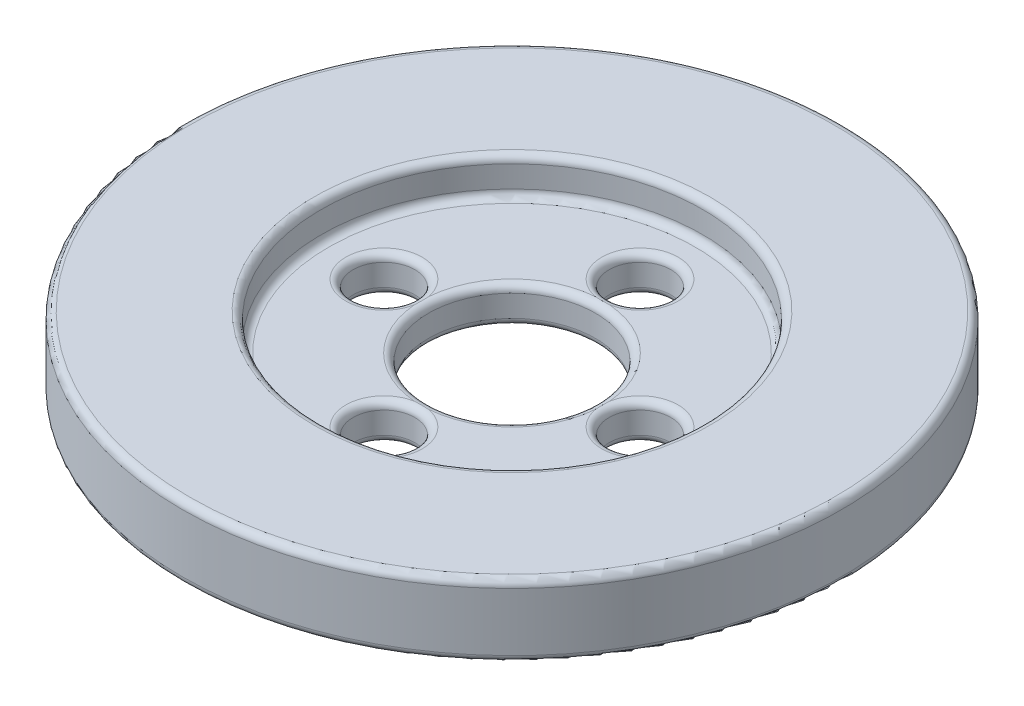
ISO-10303-21;
HEADER;
FILE_DESCRIPTION(('STEP AP214'),'2;1');
FILE_NAME('part.step','',(''),(''),'','','');
FILE_SCHEMA(('AUTOMOTIVE_DESIGN { 1 0 10303 214 1 1 1 1 }'));
ENDSEC;
DATA;
#1=APPLICATION_CONTEXT('core data for automotive mechanical design processes');
#2=APPLICATION_PROTOCOL_DEFINITION('international standard','automotive_design',2000,#1);
#3=PRODUCT_CONTEXT('',#1,'mechanical');
#4=PRODUCT('Part','Part','',(#3));
#5=PRODUCT_RELATED_PRODUCT_CATEGORY('part','',(#4));
#6=PRODUCT_DEFINITION_FORMATION('','',#4);
#7=PRODUCT_DEFINITION_CONTEXT('part definition',#1,'design');
#8=PRODUCT_DEFINITION('design','',#6,#7);
#9=PRODUCT_DEFINITION_SHAPE('','',#8);
#10=(LENGTH_UNIT() NAMED_UNIT(*) SI_UNIT(.MILLI.,.METRE.));
#11=(NAMED_UNIT(*) PLANE_ANGLE_UNIT() SI_UNIT($,.RADIAN.));
#12=(NAMED_UNIT(*) SI_UNIT($,.STERADIAN.) SOLID_ANGLE_UNIT());
#13=UNCERTAINTY_MEASURE_WITH_UNIT(LENGTH_MEASURE(1.E-05),#10,'distance_accuracy_value','');
#14=(GEOMETRIC_REPRESENTATION_CONTEXT(3) GLOBAL_UNCERTAINTY_ASSIGNED_CONTEXT((#13)) GLOBAL_UNIT_ASSIGNED_CONTEXT((#10,
#11,#12)) REPRESENTATION_CONTEXT('',''));
#15=CARTESIAN_POINT('',(0.,0.,0.));
#16=DIRECTION('',(0.,0.,1.));
#17=DIRECTION('',(1.,0.,0.));
#18=AXIS2_PLACEMENT_3D('',#15,#16,#17);
#19=CARTESIAN_POINT('',(0.,2.,0.));
#20=DIRECTION('',(0.,1.,0.));
#21=DIRECTION('',(0.,0.,1.));
#22=AXIS2_PLACEMENT_3D('',#19,#20,#21);
#23=PLANE('',#22);
#24=CARTESIAN_POINT('',(0.,2.,0.));
#25=DIRECTION('',(0.,1.,0.));
#26=DIRECTION('',(0.,0.,1.));
#27=AXIS2_PLACEMENT_3D('',#24,#25,#26);
#28=CIRCLE('',#27,10.9);
#29=CARTESIAN_POINT('',(0.,2.,10.9));
#30=VERTEX_POINT('',#29);
#31=EDGE_CURVE('E11',#30,#30,#28,.F.);
#32=ORIENTED_EDGE('',*,*,#31,.T.);
#33=EDGE_LOOP('',(#32));
#34=FACE_BOUND('',#33,.T.);
#35=CARTESIAN_POINT('',(0.,2.,0.));
#36=DIRECTION('',(0.,1.,0.));
#37=DIRECTION('',(0.,0.,1.));
#38=AXIS2_PLACEMENT_3D('',#35,#36,#37);
#39=CIRCLE('',#38,17.75);
#40=CARTESIAN_POINT('',(0.,2.,17.75));
#41=VERTEX_POINT('',#40);
#42=EDGE_CURVE('E52',#41,#41,#39,.T.);
#43=ORIENTED_EDGE('',*,*,#42,.T.);
#44=EDGE_LOOP('',(#43));
#45=FACE_BOUND('',#44,.T.);
#46=ADVANCED_FACE('F37',(#34,#45),#23,.T.);
#47=CARTESIAN_POINT('',(0.,2.,0.));
#48=DIRECTION('',(0.,-1.,0.));
#49=DIRECTION('',(0.,0.,-1.));
#50=AXIS2_PLACEMENT_3D('',#47,#48,#49);
#51=CYLINDRICAL_SURFACE('',#50,18.15);
#52=CARTESIAN_POINT('',(0.,-1.6,0.));
#53=DIRECTION('',(0.,1.,0.));
#54=DIRECTION('',(0.,0.,1.));
#55=AXIS2_PLACEMENT_3D('',#52,#53,#54);
#56=CIRCLE('',#55,18.15);
#57=CARTESIAN_POINT('',(0.,-1.6,18.15));
#58=VERTEX_POINT('',#57);
#59=EDGE_CURVE('E336',#58,#58,#56,.T.);
#60=ORIENTED_EDGE('',*,*,#59,.T.);
#61=EDGE_LOOP('',(#60));
#62=FACE_BOUND('',#61,.T.);
#63=CARTESIAN_POINT('',(0.,1.6,0.));
#64=DIRECTION('',(0.,1.,0.));
#65=DIRECTION('',(0.,0.,1.));
#66=AXIS2_PLACEMENT_3D('',#63,#64,#65);
#67=CIRCLE('',#66,18.15);
#68=CARTESIAN_POINT('',(0.,1.6,18.15));
#69=VERTEX_POINT('',#68);
#70=EDGE_CURVE('E333',#69,#69,#67,.F.);
#71=ORIENTED_EDGE('',*,*,#70,.T.);
#72=EDGE_LOOP('',(#71));
#73=FACE_BOUND('',#72,.T.);
#74=ADVANCED_FACE('F264',(#62,#73),#51,.T.);
#75=CARTESIAN_POINT('',(0.,2.,0.));
#76=DIRECTION('',(0.,-1.,0.));
#77=DIRECTION('',(0.,0.,-1.));
#78=AXIS2_PLACEMENT_3D('',#75,#76,#77);
#79=CYLINDRICAL_SURFACE('',#78,10.5);
#80=CARTESIAN_POINT('',(0.,0.4,0.));
#81=DIRECTION('',(0.,1.,0.));
#82=DIRECTION('',(0.,0.,1.));
#83=AXIS2_PLACEMENT_3D('',#80,#81,#82);
#84=CIRCLE('',#83,10.5);
#85=CARTESIAN_POINT('',(0.,0.4,10.5));
#86=VERTEX_POINT('',#85);
#87=EDGE_CURVE('E288',#86,#86,#84,.F.);
#88=ORIENTED_EDGE('',*,*,#87,.T.);
#89=EDGE_LOOP('',(#88));
#90=FACE_BOUND('',#89,.T.);
#91=CARTESIAN_POINT('',(0.,1.6,0.));
#92=DIRECTION('',(0.,1.,0.));
#93=DIRECTION('',(0.,0.,1.));
#94=AXIS2_PLACEMENT_3D('',#91,#92,#93);
#95=CIRCLE('',#94,10.5);
#96=CARTESIAN_POINT('',(0.,1.6,10.5));
#97=VERTEX_POINT('',#96);
#98=EDGE_CURVE('E293',#97,#97,#95,.T.);
#99=ORIENTED_EDGE('',*,*,#98,.T.);
#100=EDGE_LOOP('',(#99));
#101=FACE_BOUND('',#100,.T.);
#102=ADVANCED_FACE('F270',(#90,#101),#79,.F.);
#103=CARTESIAN_POINT('',(0.,0.,0.));
#104=DIRECTION('',(0.,1.,0.));
#105=DIRECTION('',(0.,0.,1.));
#106=AXIS2_PLACEMENT_3D('',#103,#104,#105);
#107=PLANE('',#106);
#108=CARTESIAN_POINT('',(0.,0.,0.));
#109=DIRECTION('',(0.,1.,0.));
#110=DIRECTION('',(0.,0.,1.));
#111=AXIS2_PLACEMENT_3D('',#108,#109,#110);
#112=CIRCLE('',#111,10.1);
#113=CARTESIAN_POINT('',(0.,0.,10.1));
#114=VERTEX_POINT('',#113);
#115=EDGE_CURVE('E291',#114,#114,#112,.T.);
#116=ORIENTED_EDGE('',*,*,#115,.T.);
#117=EDGE_LOOP('',(#116));
#118=FACE_BOUND('',#117,.T.);
#119=CARTESIAN_POINT('',(7.05,0.,0.));
#120=DIRECTION('',(0.,1.,0.));
#121=DIRECTION('',(0.,0.,1.));
#122=AXIS2_PLACEMENT_3D('',#119,#120,#121);
#123=CIRCLE('',#122,2.1);
#124=CARTESIAN_POINT('',(4.98528368794326,0.,-0.383336080648335));
#125=VERTEX_POINT('',#124);
#126=CARTESIAN_POINT('',(7.05,0.,2.1));
#127=VERTEX_POINT('',#126);
#128=EDGE_CURVE('E564',#125,#127,#123,.F.);
#129=ORIENTED_EDGE('',*,*,#128,.T.);
#130=CARTESIAN_POINT('',(7.05,0.,0.));
#131=DIRECTION('',(0.,1.,0.));
#132=DIRECTION('',(0.,0.,1.));
#133=AXIS2_PLACEMENT_3D('',#130,#131,#132);
#134=CIRCLE('',#133,2.1);
#135=CARTESIAN_POINT('',(4.98528368794326,0.,0.383336080648334));
#136=VERTEX_POINT('',#135);
#137=EDGE_CURVE('E294',#127,#136,#134,.F.);
#138=ORIENTED_EDGE('',*,*,#137,.T.);
#139=CARTESIAN_POINT('',(0.,0.,0.));
#140=DIRECTION('',(0.,1.,0.));
#141=DIRECTION('',(0.,0.,1.));
#142=AXIS2_PLACEMENT_3D('',#139,#140,#141);
#143=CIRCLE('',#142,5.);
#144=CARTESIAN_POINT('',(0.383336080648335,0.,4.98528368794326));
#145=VERTEX_POINT('',#144);
#146=EDGE_CURVE('E298',#136,#145,#143,.F.);
#147=ORIENTED_EDGE('',*,*,#146,.T.);
#148=CARTESIAN_POINT('',(0.,0.,7.05));
#149=DIRECTION('',(0.,1.,0.));
#150=DIRECTION('',(0.,0.,1.));
#151=AXIS2_PLACEMENT_3D('',#148,#149,#150);
#152=CIRCLE('',#151,2.1);
#153=CARTESIAN_POINT('',(0.,0.,9.15));
#154=VERTEX_POINT('',#153);
#155=EDGE_CURVE('E570',#145,#154,#152,.F.);
#156=ORIENTED_EDGE('',*,*,#155,.T.);
#157=CARTESIAN_POINT('',(0.,0.,7.05));
#158=DIRECTION('',(0.,1.,0.));
#159=DIRECTION('',(0.,0.,1.));
#160=AXIS2_PLACEMENT_3D('',#157,#158,#159);
#161=CIRCLE('',#160,2.1);
#162=CARTESIAN_POINT('',(-0.383336080648334,0.,4.98528368794326));
#163=VERTEX_POINT('',#162);
#164=EDGE_CURVE('E568',#154,#163,#161,.F.);
#165=ORIENTED_EDGE('',*,*,#164,.T.);
#166=CARTESIAN_POINT('',(0.,0.,0.));
#167=DIRECTION('',(0.,1.,0.));
#168=DIRECTION('',(0.,0.,1.));
#169=AXIS2_PLACEMENT_3D('',#166,#167,#168);
#170=CIRCLE('',#169,5.);
#171=CARTESIAN_POINT('',(-4.98528368794326,0.,0.383336080648333));
#172=VERTEX_POINT('',#171);
#173=EDGE_CURVE('E572',#163,#172,#170,.F.);
#174=ORIENTED_EDGE('',*,*,#173,.T.);
#175=CARTESIAN_POINT('',(-7.05,0.,0.));
#176=DIRECTION('',(0.,1.,0.));
#177=DIRECTION('',(0.,0.,1.));
#178=AXIS2_PLACEMENT_3D('',#175,#176,#177);
#179=CIRCLE('',#178,2.1);
#180=CARTESIAN_POINT('',(-7.05,0.,2.1));
#181=VERTEX_POINT('',#180);
#182=EDGE_CURVE('E132',#172,#181,#179,.F.);
#183=ORIENTED_EDGE('',*,*,#182,.T.);
#184=CARTESIAN_POINT('',(-7.05,0.,0.));
#185=DIRECTION('',(0.,1.,0.));
#186=DIRECTION('',(0.,0.,1.));
#187=AXIS2_PLACEMENT_3D('',#184,#185,#186);
#188=CIRCLE('',#187,2.1);
#189=CARTESIAN_POINT('',(-4.98528368794326,0.,-0.383336080648331));
#190=VERTEX_POINT('',#189);
#191=EDGE_CURVE('E126',#181,#190,#188,.F.);
#192=ORIENTED_EDGE('',*,*,#191,.T.);
#193=CARTESIAN_POINT('',(0.,0.,0.));
#194=DIRECTION('',(0.,1.,0.));
#195=DIRECTION('',(0.,0.,1.));
#196=AXIS2_PLACEMENT_3D('',#193,#194,#195);
#197=CIRCLE('',#196,5.);
#198=CARTESIAN_POINT('',(-0.383336080648334,0.,-4.98528368794326));
#199=VERTEX_POINT('',#198);
#200=EDGE_CURVE('E129',#190,#199,#197,.F.);
#201=ORIENTED_EDGE('',*,*,#200,.T.);
#202=CARTESIAN_POINT('',(0.,0.,-7.05));
#203=DIRECTION('',(0.,1.,0.));
#204=DIRECTION('',(0.,0.,1.));
#205=AXIS2_PLACEMENT_3D('',#202,#203,#204);
#206=CIRCLE('',#205,2.1);
#207=CARTESIAN_POINT('',(0.383336080648334,0.,-4.98528368794326));
#208=VERTEX_POINT('',#207);
#209=EDGE_CURVE('E135',#199,#208,#206,.F.);
#210=ORIENTED_EDGE('',*,*,#209,.T.);
#211=CARTESIAN_POINT('',(0.,0.,0.));
#212=DIRECTION('',(0.,1.,0.));
#213=DIRECTION('',(0.,0.,1.));
#214=AXIS2_PLACEMENT_3D('',#211,#212,#213);
#215=CIRCLE('',#214,5.);
#216=EDGE_CURVE('E567',#208,#125,#215,.F.);
#217=ORIENTED_EDGE('',*,*,#216,.T.);
#218=EDGE_LOOP('',(#129,#138,#147,#156,#165,#174,#183,#192,#201,#210,#217));
#219=FACE_BOUND('',#218,.T.);
#220=ADVANCED_FACE('F128',(#118,#219),#107,.T.);
#221=CARTESIAN_POINT('',(0.,-2.,0.));
#222=DIRECTION('',(0.,1.,0.));
#223=DIRECTION('',(0.,0.,1.));
#224=AXIS2_PLACEMENT_3D('',#221,#222,#223);
#225=PLANE('',#224);
#226=CARTESIAN_POINT('',(0.,-2.,0.));
#227=DIRECTION('',(0.,1.,0.));
#228=DIRECTION('',(0.,0.,1.));
#229=AXIS2_PLACEMENT_3D('',#226,#227,#228);
#230=CIRCLE('',#229,17.75);
#231=CARTESIAN_POINT('',(0.,-2.,17.75));
#232=VERTEX_POINT('',#231);
#233=EDGE_CURVE('E360',#232,#232,#230,.F.);
#234=ORIENTED_EDGE('',*,*,#233,.T.);
#235=EDGE_LOOP('',(#234));
#236=FACE_BOUND('',#235,.T.);
#237=CARTESIAN_POINT('',(-7.05,-2.,0.));
#238=DIRECTION('',(0.,1.,0.));
#239=DIRECTION('',(0.,0.,1.));
#240=AXIS2_PLACEMENT_3D('',#237,#238,#239);
#241=CIRCLE('',#240,2.1);
#242=CARTESIAN_POINT('',(-7.05,-2.,2.1));
#243=VERTEX_POINT('',#242);
#244=CARTESIAN_POINT('',(-4.98528368794326,-2.,0.383336080648325));
#245=VERTEX_POINT('',#244);
#246=EDGE_CURVE('E60',#243,#245,#241,.T.);
#247=ORIENTED_EDGE('',*,*,#246,.T.);
#248=CARTESIAN_POINT('',(0.,-2.,0.));
#249=DIRECTION('',(0.,1.,0.));
#250=DIRECTION('',(0.,0.,1.));
#251=AXIS2_PLACEMENT_3D('',#248,#249,#250);
#252=CIRCLE('',#251,5.);
#253=CARTESIAN_POINT('',(-0.383336080648324,-2.,4.98528368794326));
#254=VERTEX_POINT('',#253);
#255=EDGE_CURVE('E65',#245,#254,#252,.T.);
#256=ORIENTED_EDGE('',*,*,#255,.T.);
#257=CARTESIAN_POINT('',(0.,-2.,7.05));
#258=DIRECTION('',(0.,1.,0.));
#259=DIRECTION('',(0.,0.,1.));
#260=AXIS2_PLACEMENT_3D('',#257,#258,#259);
#261=CIRCLE('',#260,2.1);
#262=CARTESIAN_POINT('',(0.,-2.,9.15));
#263=VERTEX_POINT('',#262);
#264=EDGE_CURVE('E356',#254,#263,#261,.T.);
#265=ORIENTED_EDGE('',*,*,#264,.T.);
#266=CARTESIAN_POINT('',(0.,-2.,7.05));
#267=DIRECTION('',(0.,1.,0.));
#268=DIRECTION('',(0.,0.,1.));
#269=AXIS2_PLACEMENT_3D('',#266,#267,#268);
#270=CIRCLE('',#269,2.1);
#271=CARTESIAN_POINT('',(0.383336080648325,-2.,4.98528368794326));
#272=VERTEX_POINT('',#271);
#273=EDGE_CURVE('E354',#263,#272,#270,.T.);
#274=ORIENTED_EDGE('',*,*,#273,.T.);
#275=CARTESIAN_POINT('',(0.,-2.,0.));
#276=DIRECTION('',(0.,1.,0.));
#277=DIRECTION('',(0.,0.,1.));
#278=AXIS2_PLACEMENT_3D('',#275,#276,#277);
#279=CIRCLE('',#278,5.);
#280=CARTESIAN_POINT('',(4.98528368794326,-2.,0.383336080648333));
#281=VERTEX_POINT('',#280);
#282=EDGE_CURVE('E352',#272,#281,#279,.T.);
#283=ORIENTED_EDGE('',*,*,#282,.T.);
#284=CARTESIAN_POINT('',(7.05,-2.,0.));
#285=DIRECTION('',(0.,1.,0.));
#286=DIRECTION('',(0.,0.,1.));
#287=AXIS2_PLACEMENT_3D('',#284,#285,#286);
#288=CIRCLE('',#287,2.1);
#289=CARTESIAN_POINT('',(7.05,-2.,2.1));
#290=VERTEX_POINT('',#289);
#291=EDGE_CURVE('E348',#281,#290,#288,.T.);
#292=ORIENTED_EDGE('',*,*,#291,.T.);
#293=CARTESIAN_POINT('',(7.05,-2.,0.));
#294=DIRECTION('',(0.,1.,0.));
#295=DIRECTION('',(0.,0.,1.));
#296=AXIS2_PLACEMENT_3D('',#293,#294,#295);
#297=CIRCLE('',#296,2.1);
#298=CARTESIAN_POINT('',(4.98528368794326,-2.,-0.383336080648333));
#299=VERTEX_POINT('',#298);
#300=EDGE_CURVE('E346',#290,#299,#297,.T.);
#301=ORIENTED_EDGE('',*,*,#300,.T.);
#302=CARTESIAN_POINT('',(0.,-2.,0.));
#303=DIRECTION('',(0.,1.,0.));
#304=DIRECTION('',(0.,0.,1.));
#305=AXIS2_PLACEMENT_3D('',#302,#303,#304);
#306=CIRCLE('',#305,5.);
#307=CARTESIAN_POINT('',(0.383336080648324,-2.,-4.98528368794326));
#308=VERTEX_POINT('',#307);
#309=EDGE_CURVE('E341',#299,#308,#306,.T.);
#310=ORIENTED_EDGE('',*,*,#309,.T.);
#311=CARTESIAN_POINT('',(0.,-2.,-7.05));
#312=DIRECTION('',(0.,1.,0.));
#313=DIRECTION('',(0.,0.,1.));
#314=AXIS2_PLACEMENT_3D('',#311,#312,#313);
#315=CIRCLE('',#314,2.1);
#316=CARTESIAN_POINT('',(-0.383336080648324,-2.,-4.98528368794326));
#317=VERTEX_POINT('',#316);
#318=EDGE_CURVE('E339',#308,#317,#315,.T.);
#319=ORIENTED_EDGE('',*,*,#318,.T.);
#320=CARTESIAN_POINT('',(0.,-2.,0.));
#321=DIRECTION('',(0.,1.,0.));
#322=DIRECTION('',(0.,0.,1.));
#323=AXIS2_PLACEMENT_3D('',#320,#321,#322);
#324=CIRCLE('',#323,5.);
#325=CARTESIAN_POINT('',(-4.98528368794326,-2.,-0.383336080648323));
#326=VERTEX_POINT('',#325);
#327=EDGE_CURVE('E343',#317,#326,#324,.T.);
#328=ORIENTED_EDGE('',*,*,#327,.T.);
#329=CARTESIAN_POINT('',(-7.05,-2.,0.));
#330=DIRECTION('',(0.,1.,0.));
#331=DIRECTION('',(0.,0.,1.));
#332=AXIS2_PLACEMENT_3D('',#329,#330,#331);
#333=CIRCLE('',#332,2.1);
#334=EDGE_CURVE('E350',#326,#243,#333,.T.);
#335=ORIENTED_EDGE('',*,*,#334,.T.);
#336=EDGE_LOOP('',(#247,#256,#265,#274,#283,#292,#301,#310,#319,#328,#335));
#337=FACE_BOUND('',#336,.T.);
#338=ADVANCED_FACE('F367',(#236,#337),#225,.F.);
#339=CARTESIAN_POINT('',(0.,-2.,0.));
#340=DIRECTION('',(0.,1.,0.));
#341=DIRECTION('',(0.,0.,1.));
#342=AXIS2_PLACEMENT_3D('',#339,#340,#341);
#343=CYLINDRICAL_SURFACE('',#342,4.6);
#344=CARTESIAN_POINT('',(0.,-0.4,0.));
#345=DIRECTION('',(0.,1.,0.));
#346=DIRECTION('',(0.,0.,1.));
#347=AXIS2_PLACEMENT_3D('',#344,#345,#346);
#348=CIRCLE('',#347,4.6);
#349=CARTESIAN_POINT('',(0.,-0.4,4.6));
#350=VERTEX_POINT('',#349);
#351=EDGE_CURVE('E330',#350,#350,#348,.T.);
#352=ORIENTED_EDGE('',*,*,#351,.T.);
#353=EDGE_LOOP('',(#352));
#354=FACE_BOUND('',#353,.T.);
#355=CARTESIAN_POINT('',(0.,-1.6,0.));
#356=DIRECTION('',(0.,1.,0.));
#357=DIRECTION('',(0.,0.,1.));
#358=AXIS2_PLACEMENT_3D('',#355,#356,#357);
#359=CIRCLE('',#358,4.6);
#360=CARTESIAN_POINT('',(0.,-1.6,4.6));
#361=VERTEX_POINT('',#360);
#362=EDGE_CURVE('E327',#361,#361,#359,.F.);
#363=ORIENTED_EDGE('',*,*,#362,.T.);
#364=EDGE_LOOP('',(#363));
#365=FACE_BOUND('',#364,.T.);
#366=ADVANCED_FACE('F373',(#354,#365),#343,.F.);
#367=CARTESIAN_POINT('',(-7.05,-2.,0.));
#368=DIRECTION('',(0.,1.,0.));
#369=DIRECTION('',(0.,0.,1.));
#370=AXIS2_PLACEMENT_3D('',#367,#368,#369);
#371=CYLINDRICAL_SURFACE('',#370,1.7);
#372=CARTESIAN_POINT('',(-7.05,-0.4,0.));
#373=DIRECTION('',(0.,1.,0.));
#374=DIRECTION('',(0.,0.,1.));
#375=AXIS2_PLACEMENT_3D('',#372,#373,#374);
#376=CIRCLE('',#375,1.7);
#377=CARTESIAN_POINT('',(-7.05,-0.4,1.7));
#378=VERTEX_POINT('',#377);
#379=EDGE_CURVE('E306',#378,#378,#376,.T.);
#380=ORIENTED_EDGE('',*,*,#379,.T.);
#381=EDGE_LOOP('',(#380));
#382=FACE_BOUND('',#381,.T.);
#383=CARTESIAN_POINT('',(-7.05,-1.6,0.));
#384=DIRECTION('',(0.,1.,0.));
#385=DIRECTION('',(0.,0.,1.));
#386=AXIS2_PLACEMENT_3D('',#383,#384,#385);
#387=CIRCLE('',#386,1.7);
#388=CARTESIAN_POINT('',(-7.05,-1.6,1.7));
#389=VERTEX_POINT('',#388);
#390=EDGE_CURVE('E303',#389,#389,#387,.F.);
#391=ORIENTED_EDGE('',*,*,#390,.T.);
#392=EDGE_LOOP('',(#391));
#393=FACE_BOUND('',#392,.T.);
#394=ADVANCED_FACE('F379',(#382,#393),#371,.F.);
#395=CARTESIAN_POINT('',(0.,-2.,7.05));
#396=DIRECTION('',(0.,1.,0.));
#397=DIRECTION('',(0.,0.,1.));
#398=AXIS2_PLACEMENT_3D('',#395,#396,#397);
#399=CYLINDRICAL_SURFACE('',#398,1.7);
#400=CARTESIAN_POINT('',(0.,-0.4,7.05));
#401=DIRECTION('',(0.,1.,0.));
#402=DIRECTION('',(0.,0.,1.));
#403=AXIS2_PLACEMENT_3D('',#400,#401,#402);
#404=CIRCLE('',#403,1.7);
#405=CARTESIAN_POINT('',(0.,-0.4,8.75));
#406=VERTEX_POINT('',#405);
#407=EDGE_CURVE('E312',#406,#406,#404,.T.);
#408=ORIENTED_EDGE('',*,*,#407,.T.);
#409=EDGE_LOOP('',(#408));
#410=FACE_BOUND('',#409,.T.);
#411=CARTESIAN_POINT('',(0.,-1.6,7.05));
#412=DIRECTION('',(0.,1.,0.));
#413=DIRECTION('',(0.,0.,1.));
#414=AXIS2_PLACEMENT_3D('',#411,#412,#413);
#415=CIRCLE('',#414,1.7);
#416=CARTESIAN_POINT('',(0.,-1.6,8.75));
#417=VERTEX_POINT('',#416);
#418=EDGE_CURVE('E309',#417,#417,#415,.F.);
#419=ORIENTED_EDGE('',*,*,#418,.T.);
#420=EDGE_LOOP('',(#419));
#421=FACE_BOUND('',#420,.T.);
#422=ADVANCED_FACE('F384',(#410,#421),#399,.F.);
#423=CARTESIAN_POINT('',(7.05,-2.,0.));
#424=DIRECTION('',(0.,1.,0.));
#425=DIRECTION('',(0.,0.,1.));
#426=AXIS2_PLACEMENT_3D('',#423,#424,#425);
#427=CYLINDRICAL_SURFACE('',#426,1.7);
#428=CARTESIAN_POINT('',(7.05,-0.4,0.));
#429=DIRECTION('',(0.,1.,0.));
#430=DIRECTION('',(0.,0.,1.));
#431=AXIS2_PLACEMENT_3D('',#428,#429,#430);
#432=CIRCLE('',#431,1.7);
#433=CARTESIAN_POINT('',(7.05,-0.4,1.7));
#434=VERTEX_POINT('',#433);
#435=EDGE_CURVE('E318',#434,#434,#432,.T.);
#436=ORIENTED_EDGE('',*,*,#435,.T.);
#437=EDGE_LOOP('',(#436));
#438=FACE_BOUND('',#437,.T.);
#439=CARTESIAN_POINT('',(7.05,-1.6,0.));
#440=DIRECTION('',(0.,1.,0.));
#441=DIRECTION('',(0.,0.,1.));
#442=AXIS2_PLACEMENT_3D('',#439,#440,#441);
#443=CIRCLE('',#442,1.7);
#444=CARTESIAN_POINT('',(7.05,-1.6,1.7));
#445=VERTEX_POINT('',#444);
#446=EDGE_CURVE('E315',#445,#445,#443,.F.);
#447=ORIENTED_EDGE('',*,*,#446,.T.);
#448=EDGE_LOOP('',(#447));
#449=FACE_BOUND('',#448,.T.);
#450=ADVANCED_FACE('F282',(#438,#449),#427,.F.);
#451=CARTESIAN_POINT('',(0.,-2.,-7.05));
#452=DIRECTION('',(0.,1.,0.));
#453=DIRECTION('',(0.,0.,1.));
#454=AXIS2_PLACEMENT_3D('',#451,#452,#453);
#455=CYLINDRICAL_SURFACE('',#454,1.7);
#456=CARTESIAN_POINT('',(0.,-0.4,-7.05));
#457=DIRECTION('',(0.,1.,0.));
#458=DIRECTION('',(0.,0.,1.));
#459=AXIS2_PLACEMENT_3D('',#456,#457,#458);
#460=CIRCLE('',#459,1.7);
#461=CARTESIAN_POINT('',(0.,-0.4,-5.35));
#462=VERTEX_POINT('',#461);
#463=EDGE_CURVE('E324',#462,#462,#460,.T.);
#464=ORIENTED_EDGE('',*,*,#463,.T.);
#465=EDGE_LOOP('',(#464));
#466=FACE_BOUND('',#465,.T.);
#467=CARTESIAN_POINT('',(0.,-1.6,-7.05));
#468=DIRECTION('',(0.,1.,0.));
#469=DIRECTION('',(0.,0.,1.));
#470=AXIS2_PLACEMENT_3D('',#467,#468,#469);
#471=CIRCLE('',#470,1.7);
#472=CARTESIAN_POINT('',(0.,-1.6,-5.35));
#473=VERTEX_POINT('',#472);
#474=EDGE_CURVE('E321',#473,#473,#471,.F.);
#475=ORIENTED_EDGE('',*,*,#474,.T.);
#476=EDGE_LOOP('',(#475));
#477=FACE_BOUND('',#476,.T.);
#478=ADVANCED_FACE('F277',(#466,#477),#455,.F.);
#479=CARTESIAN_POINT('',(0.,0.4,0.));
#480=DIRECTION('',(0.,1.,0.));
#481=DIRECTION('',(0.,0.,1.));
#482=AXIS2_PLACEMENT_3D('',#479,#480,#481);
#483=TOROIDAL_SURFACE('',#482,10.1,0.4);
#484=ORIENTED_EDGE('',*,*,#87,.F.);
#485=EDGE_LOOP('',(#484));
#486=FACE_BOUND('',#485,.T.);
#487=ORIENTED_EDGE('',*,*,#115,.F.);
#488=EDGE_LOOP('',(#487));
#489=FACE_BOUND('',#488,.T.);
#490=ADVANCED_FACE('F214',(#486,#489),#483,.F.);
#491=CARTESIAN_POINT('',(0.,-0.4,-7.05));
#492=DIRECTION('',(0.,1.,0.));
#493=DIRECTION('',(0.,0.,1.));
#494=AXIS2_PLACEMENT_3D('',#491,#492,#493);
#495=TOROIDAL_SURFACE('',#494,2.1,0.4);
#496=ORIENTED_EDGE('',*,*,#463,.F.);
#497=EDGE_LOOP('',(#496));
#498=FACE_BOUND('',#497,.T.);
#499=CARTESIAN_POINT('',(0.383336080648332,0.,-4.98528368794326));
#500=CARTESIAN_POINT('',(0.380711690234593,-2.65302366956298E-08,-4.98514337401453));
#501=CARTESIAN_POINT('',(0.37808721917533,-4.60717296241722E-07,-4.98500447822806));
#502=CARTESIAN_POINT('',(0.312946427233794,-2.08605850699514E-05,-4.98159234067511));
#503=CARTESIAN_POINT('',(0.250385418756128,-0.000260431056043048,-4.97912298079142));
#504=CARTESIAN_POINT('',(0.125216275669466,-0.000641011746865412,-4.97582674779241));
#505=CARTESIAN_POINT('',(0.0626081378294804,-0.000782014446546546,-4.97499999999031));
#506=CARTESIAN_POINT('',(-0.0626081378454869,-0.000782014419867156,-4.9750000000097));
#507=CARTESIAN_POINT('',(-0.125216275680468,-0.000641011693521305,-4.9758267478311));
#508=CARTESIAN_POINT('',(-0.25038541876368,-0.000260431109328775,-4.97912298075325));
#509=CARTESIAN_POINT('',(-0.3129464272429,-2.0860771638689E-05,-4.98159234054076));
#510=CARTESIAN_POINT('',(-0.378087219174782,-4.6073269065644E-07,-4.98500447821691));
#511=CARTESIAN_POINT('',(-0.380711690234329,-2.65382099770394E-08,-4.98514337400876));
#512=CARTESIAN_POINT('',(-0.383336080648332,0.,-4.98528368794326));
#513=B_SPLINE_CURVE_WITH_KNOTS('',3,(#499,#500,#501,#502,#503,#504,#505,#506,#507,#508,#509,
#510,#511,#512),.UNSPECIFIED.,.F.,.F.,(4,2,2,2,2,2,4),(0.,0.00788443001082531,0.195689936515872,
0.383509769964404,0.571329603403163,0.759135109897177,0.767019539909712),.UNSPECIFIED.);
#514=EDGE_CURVE('E145',#208,#199,#513,.T.);
#515=ORIENTED_EDGE('',*,*,#514,.F.);
#516=ORIENTED_EDGE('',*,*,#209,.F.);
#517=EDGE_LOOP('',(#515,#516));
#518=FACE_BOUND('',#517,.T.);
#519=ADVANCED_FACE('F210',(#498,#518),#495,.T.);
#520=CARTESIAN_POINT('',(7.05,-0.4,0.));
#521=DIRECTION('',(0.,1.,0.));
#522=DIRECTION('',(0.,0.,1.));
#523=AXIS2_PLACEMENT_3D('',#520,#521,#522);
#524=TOROIDAL_SURFACE('',#523,2.1,0.4);
#525=ORIENTED_EDGE('',*,*,#435,.F.);
#526=EDGE_LOOP('',(#525));
#527=FACE_BOUND('',#526,.T.);
#528=ORIENTED_EDGE('',*,*,#137,.F.);
#529=ORIENTED_EDGE('',*,*,#128,.F.);
#530=CARTESIAN_POINT('',(4.98528368794326,0.,0.383336080648335));
#531=CARTESIAN_POINT('',(4.98514337401454,-2.65302279165272E-08,0.380711690234595));
#532=CARTESIAN_POINT('',(4.98500447822807,-4.60717292019276E-07,0.378087219175332));
#533=CARTESIAN_POINT('',(4.98159234067521,-2.08605851711573E-05,0.31294642723379));
#534=CARTESIAN_POINT('',(4.97912298079145,-0.000260431056070169,0.250385418756125));
#535=CARTESIAN_POINT('',(4.97582674779238,-0.000641011746838326,0.125216275669465));
#536=CARTESIAN_POINT('',(4.9749999999903,-0.000782014446539349,0.0626081378294787));
#537=CARTESIAN_POINT('',(4.9750000000097,-0.000782014419874412,-0.0626081378454887));
#538=CARTESIAN_POINT('',(4.97582674783108,-0.000641011693523126,-0.12521627568047));
#539=CARTESIAN_POINT('',(4.97912298075327,-0.000260431109327018,-0.25038541876368));
#540=CARTESIAN_POINT('',(4.98159234054085,-2.08607716387847E-05,-0.312946427242898));
#541=CARTESIAN_POINT('',(4.98500447821692,-4.60732690686513E-07,-0.378087219174786));
#542=CARTESIAN_POINT('',(4.98514337400876,-2.6538210001093E-08,-0.380711690234333));
#543=CARTESIAN_POINT('',(4.98528368794326,0.,-0.383336080648336));
#544=B_SPLINE_CURVE_WITH_KNOTS('',3,(#530,#531,#532,#533,#534,#535,#536,#537,#538,#539,#540,
#541,#542,#543),.UNSPECIFIED.,.F.,.F.,(4,2,2,2,2,2,4),(0.,0.00788443001082564,0.195689936515878,
0.383509769964408,0.571329603403165,0.759135109897185,0.767019539909718),.UNSPECIFIED.);
#545=EDGE_CURVE('E152',#136,#125,#544,.T.);
#546=ORIENTED_EDGE('',*,*,#545,.F.);
#547=EDGE_LOOP('',(#528,#529,#546));
#548=FACE_BOUND('',#547,.T.);
#549=ADVANCED_FACE('F181',(#527,#548),#524,.T.);
#550=CARTESIAN_POINT('',(0.,-0.4,7.05));
#551=DIRECTION('',(0.,1.,0.));
#552=DIRECTION('',(0.,0.,1.));
#553=AXIS2_PLACEMENT_3D('',#550,#551,#552);
#554=TOROIDAL_SURFACE('',#553,2.1,0.4);
#555=ORIENTED_EDGE('',*,*,#407,.F.);
#556=EDGE_LOOP('',(#555));
#557=FACE_BOUND('',#556,.T.);
#558=ORIENTED_EDGE('',*,*,#164,.F.);
#559=ORIENTED_EDGE('',*,*,#155,.F.);
#560=CARTESIAN_POINT('',(0.383336080648333,0.,4.98528368794326));
#561=CARTESIAN_POINT('',(0.380711690234594,-2.65302366789783E-08,4.98514337401454));
#562=CARTESIAN_POINT('',(0.378087219175331,-4.60717296225122E-07,4.98500447822806));
#563=CARTESIAN_POINT('',(0.312946427233796,-2.0860585069935E-05,4.98159234067511));
#564=CARTESIAN_POINT('',(0.25038541875613,-0.000260431056043007,4.97912298079142));
#565=CARTESIAN_POINT('',(0.12521627566947,-0.000641011746865358,4.97582674779241));
#566=CARTESIAN_POINT('',(0.0626081378294859,-0.000782014446546505,4.97499999999031));
#567=CARTESIAN_POINT('',(-0.0626081378454811,-0.000782014419867129,4.97500000000969));
#568=CARTESIAN_POINT('',(-0.125216275680464,-0.000641011693521272,4.97582674783108));
#569=CARTESIAN_POINT('',(-0.250385418763676,-0.000260431109328869,4.97912298075327));
#570=CARTESIAN_POINT('',(-0.312946427242894,-2.08607716389152E-05,4.98159234054084));
#571=CARTESIAN_POINT('',(-0.378087219174781,-4.60732690679565E-07,4.98500447821691));
#572=CARTESIAN_POINT('',(-0.380711690234329,-2.653820999141E-08,4.98514337400876));
#573=CARTESIAN_POINT('',(-0.383336080648331,0.,4.98528368794326));
#574=B_SPLINE_CURVE_WITH_KNOTS('',3,(#560,#561,#562,#563,#564,#565,#566,#567,#568,#569,#570,
#571,#572,#573),.UNSPECIFIED.,.F.,.F.,(4,2,2,2,2,2,4),(0.,0.00788443001082526,0.19568993651587,
0.383509769964399,0.571329603403159,0.759135109897179,0.767019539909713),.UNSPECIFIED.);
#575=EDGE_CURVE('E149',#163,#145,#574,.F.);
#576=ORIENTED_EDGE('',*,*,#575,.F.);
#577=EDGE_LOOP('',(#558,#559,#576));
#578=FACE_BOUND('',#577,.T.);
#579=ADVANCED_FACE('F175',(#557,#578),#554,.T.);
#580=CARTESIAN_POINT('',(0.,-0.4,0.));
#581=DIRECTION('',(0.,1.,0.));
#582=DIRECTION('',(0.,0.,1.));
#583=AXIS2_PLACEMENT_3D('',#580,#581,#582);
#584=TOROIDAL_SURFACE('',#583,5.,0.4);
#585=ORIENTED_EDGE('',*,*,#351,.F.);
#586=EDGE_LOOP('',(#585));
#587=FACE_BOUND('',#586,.T.);
#588=CARTESIAN_POINT('',(-4.98528368794326,0.,0.38333608064833));
#589=CARTESIAN_POINT('',(-4.98514337401454,-2.65302226988524E-08,0.38071169023459));
#590=CARTESIAN_POINT('',(-4.98500447822806,-4.60717289481855E-07,0.378087219175327));
#591=CARTESIAN_POINT('',(-4.98159234067511,-2.0860585230631E-05,0.312946427233792));
#592=CARTESIAN_POINT('',(-4.97912298079142,-0.000260431056086005,0.250385418756128));
#593=CARTESIAN_POINT('',(-4.97582674779241,-0.000641011746822289,0.125216275669469));
#594=CARTESIAN_POINT('',(-4.97499999999031,-0.000782014446535079,0.0626081378294865));
#595=CARTESIAN_POINT('',(-4.97500000000969,-0.000782014419878617,-0.0626081378454795));
#596=CARTESIAN_POINT('',(-4.97582674783107,-0.000641011693524025,-0.125216275680463));
#597=CARTESIAN_POINT('',(-4.97912298075329,-0.000260431109326046,-0.250385418763674));
#598=CARTESIAN_POINT('',(-4.98159234054089,-2.08607716392479E-05,-0.312946427242891));
#599=CARTESIAN_POINT('',(-4.98500447821692,-4.6073269070414E-07,-0.378087219174781));
#600=CARTESIAN_POINT('',(-4.98514337400877,-2.65382099974866E-08,-0.380711690234328));
#601=CARTESIAN_POINT('',(-4.98528368794326,0.,-0.383336080648331));
#602=B_SPLINE_CURVE_WITH_KNOTS('',3,(#588,#589,#590,#591,#592,#593,#594,#595,#596,#597,#598,
#599,#600,#601),.UNSPECIFIED.,.F.,.F.,(4,2,2,2,2,2,4),(0.,0.0078844300108258,0.195689936515869,
0.383509769964393,0.571329603403154,0.759135109897176,0.767019539909709),.UNSPECIFIED.);
#603=EDGE_CURVE('E142',#172,#190,#602,.T.);
#604=ORIENTED_EDGE('',*,*,#603,.F.);
#605=ORIENTED_EDGE('',*,*,#173,.F.);
#606=ORIENTED_EDGE('',*,*,#575,.T.);
#607=ORIENTED_EDGE('',*,*,#146,.F.);
#608=ORIENTED_EDGE('',*,*,#545,.T.);
#609=ORIENTED_EDGE('',*,*,#216,.F.);
#610=ORIENTED_EDGE('',*,*,#514,.T.);
#611=ORIENTED_EDGE('',*,*,#200,.F.);
#612=EDGE_LOOP('',(#604,#605,#606,#607,#608,#609,#610,#611));
#613=FACE_BOUND('',#612,.T.);
#614=ADVANCED_FACE('F140',(#587,#613),#584,.T.);
#615=CARTESIAN_POINT('',(-7.05,-0.4,0.));
#616=DIRECTION('',(0.,1.,0.));
#617=DIRECTION('',(0.,0.,1.));
#618=AXIS2_PLACEMENT_3D('',#615,#616,#617);
#619=TOROIDAL_SURFACE('',#618,2.1,0.4);
#620=ORIENTED_EDGE('',*,*,#182,.F.);
#621=ORIENTED_EDGE('',*,*,#603,.T.);
#622=ORIENTED_EDGE('',*,*,#191,.F.);
#623=EDGE_LOOP('',(#620,#621,#622));
#624=FACE_BOUND('',#623,.T.);
#625=ORIENTED_EDGE('',*,*,#379,.F.);
#626=EDGE_LOOP('',(#625));
#627=FACE_BOUND('',#626,.T.);
#628=ADVANCED_FACE('F147',(#624,#627),#619,.T.);
#629=CARTESIAN_POINT('',(0.,-1.6,0.));
#630=DIRECTION('',(0.,1.,0.));
#631=DIRECTION('',(0.,0.,1.));
#632=AXIS2_PLACEMENT_3D('',#629,#630,#631);
#633=TOROIDAL_SURFACE('',#632,17.75,0.4);
#634=ORIENTED_EDGE('',*,*,#233,.F.);
#635=EDGE_LOOP('',(#634));
#636=FACE_BOUND('',#635,.T.);
#637=ORIENTED_EDGE('',*,*,#59,.F.);
#638=EDGE_LOOP('',(#637));
#639=FACE_BOUND('',#638,.T.);
#640=ADVANCED_FACE('F178',(#636,#639),#633,.T.);
#641=CARTESIAN_POINT('',(0.,-1.6,-7.05));
#642=DIRECTION('',(0.,1.,0.));
#643=DIRECTION('',(0.,0.,1.));
#644=AXIS2_PLACEMENT_3D('',#641,#642,#643);
#645=TOROIDAL_SURFACE('',#644,2.1,0.4);
#646=ORIENTED_EDGE('',*,*,#474,.F.);
#647=EDGE_LOOP('',(#646));
#648=FACE_BOUND('',#647,.T.);
#649=CARTESIAN_POINT('',(0.383336080648332,-2.,-4.98528368794326));
#650=CARTESIAN_POINT('',(0.380711690234592,-1.99999997346976,-4.98514337401454));
#651=CARTESIAN_POINT('',(0.37808721917533,-1.9999995392827,-4.98500447822807));
#652=CARTESIAN_POINT('',(0.312946427233788,-1.99997913941493,-4.9815923406752));
#653=CARTESIAN_POINT('',(0.250385418756125,-1.99973956894396,-4.97912298079144));
#654=CARTESIAN_POINT('',(0.125216275669465,-1.99935898825313,-4.97582674779238));
#655=CARTESIAN_POINT('',(0.0626081378294793,-1.99921798555345,-4.97499999999031));
#656=CARTESIAN_POINT('',(-0.062608137845487,-1.99921798558013,-4.9750000000097));
#657=CARTESIAN_POINT('',(-0.125216275680468,-1.99935898830648,-4.97582674783108));
#658=CARTESIAN_POINT('',(-0.250385418763677,-1.99973956889067,-4.97912298075327));
#659=CARTESIAN_POINT('',(-0.312946427242894,-1.99997913922836,-4.98159234054084));
#660=CARTESIAN_POINT('',(-0.378087219174781,-1.99999953926731,-4.98500447821691));
#661=CARTESIAN_POINT('',(-0.380711690234329,-1.99999997346179,-4.98514337400876));
#662=CARTESIAN_POINT('',(-0.383336080648332,-2.,-4.98528368794326));
#663=B_SPLINE_CURVE_WITH_KNOTS('',3,(#649,#650,#651,#652,#653,#654,#655,#656,#657,#658,#659,
#660,#661,#662),.UNSPECIFIED.,.F.,.F.,(4,2,2,2,2,2,4),(0.,0.0078844300108253,0.195689936515875,
0.383509769964405,0.57132960340316,0.759135109897177,0.767019539909712),.UNSPECIFIED.);
#664=EDGE_CURVE('E41',#317,#308,#663,.F.);
#665=ORIENTED_EDGE('',*,*,#664,.F.);
#666=ORIENTED_EDGE('',*,*,#318,.F.);
#667=EDGE_LOOP('',(#665,#666));
#668=FACE_BOUND('',#667,.T.);
#669=ADVANCED_FACE('F217',(#648,#668),#645,.T.);
#670=CARTESIAN_POINT('',(-7.05,-1.6,0.));
#671=DIRECTION('',(0.,1.,0.));
#672=DIRECTION('',(0.,0.,1.));
#673=AXIS2_PLACEMENT_3D('',#670,#671,#672);
#674=TOROIDAL_SURFACE('',#673,2.1,0.4);
#675=ORIENTED_EDGE('',*,*,#390,.F.);
#676=EDGE_LOOP('',(#675));
#677=FACE_BOUND('',#676,.T.);
#678=ORIENTED_EDGE('',*,*,#246,.F.);
#679=ORIENTED_EDGE('',*,*,#334,.F.);
#680=CARTESIAN_POINT('',(-4.98528368794326,-2.00000000000002,0.38333608064833));
#681=CARTESIAN_POINT('',(-4.98514337401454,-1.99999997346978,0.38071169023459));
#682=CARTESIAN_POINT('',(-4.98500447822807,-1.99999953928271,0.378087219175327));
#683=CARTESIAN_POINT('',(-4.9815923406752,-1.99997913941477,0.312946427233786));
#684=CARTESIAN_POINT('',(-4.97912298079144,-1.99973956894391,0.250385418756122));
#685=CARTESIAN_POINT('',(-4.97582674779238,-1.99935898825318,0.125216275669462));
#686=CARTESIAN_POINT('',(-4.9749999999903,-1.99921798555347,0.0626081378294763));
#687=CARTESIAN_POINT('',(-4.9750000000097,-1.99921798558012,-0.0626081378454894));
#688=CARTESIAN_POINT('',(-4.97582674783109,-1.99935898830648,-0.12521627568047));
#689=CARTESIAN_POINT('',(-4.97912298075327,-1.99973956889067,-0.250385418763678));
#690=CARTESIAN_POINT('',(-4.98159234054082,-1.99997913922836,-0.312946427242896));
#691=CARTESIAN_POINT('',(-4.98500447821691,-1.99999953926731,-0.378087219174781));
#692=CARTESIAN_POINT('',(-4.98514337400876,-1.99999997346179,-0.380711690234328));
#693=CARTESIAN_POINT('',(-4.98528368794326,-2.,-0.383336080648331));
#694=B_SPLINE_CURVE_WITH_KNOTS('',3,(#680,#681,#682,#683,#684,#685,#686,#687,#688,#689,#690,
#691,#692,#693),.UNSPECIFIED.,.F.,.F.,(4,2,2,2,2,2,4),(0.,0.00788443001082579,0.195689936515876,
0.383509769964405,0.57132960340316,0.759135109897175,0.767019539909709),.UNSPECIFIED.);
#695=EDGE_CURVE('E155',#245,#326,#694,.T.);
#696=ORIENTED_EDGE('',*,*,#695,.F.);
#697=EDGE_LOOP('',(#678,#679,#696));
#698=FACE_BOUND('',#697,.T.);
#699=ADVANCED_FACE('F243',(#677,#698),#674,.T.);
#700=CARTESIAN_POINT('',(0.,-1.6,7.05));
#701=DIRECTION('',(0.,1.,0.));
#702=DIRECTION('',(0.,0.,1.));
#703=AXIS2_PLACEMENT_3D('',#700,#701,#702);
#704=TOROIDAL_SURFACE('',#703,2.1,0.4);
#705=ORIENTED_EDGE('',*,*,#418,.F.);
#706=EDGE_LOOP('',(#705));
#707=FACE_BOUND('',#706,.T.);
#708=ORIENTED_EDGE('',*,*,#273,.F.);
#709=ORIENTED_EDGE('',*,*,#264,.F.);
#710=CARTESIAN_POINT('',(0.383336080648333,-2.,4.98528368794326));
#711=CARTESIAN_POINT('',(0.380711690234593,-1.99999997346976,4.98514337401454));
#712=CARTESIAN_POINT('',(0.378087219175331,-1.9999995392827,4.98500447822807));
#713=CARTESIAN_POINT('',(0.312946427233789,-1.99997913941493,4.9815923406752));
#714=CARTESIAN_POINT('',(0.250385418756125,-1.99973956894396,4.97912298079144));
#715=CARTESIAN_POINT('',(0.125216275669465,-1.99935898825313,4.97582674779238));
#716=CARTESIAN_POINT('',(0.0626081378294797,-1.99921798555345,4.9749999999903));
#717=CARTESIAN_POINT('',(-0.0626081378454866,-1.99921798558013,4.9750000000097));
#718=CARTESIAN_POINT('',(-0.125216275680467,-1.99935898830648,4.97582674783109));
#719=CARTESIAN_POINT('',(-0.250385418763676,-1.99973956889067,4.97912298075327));
#720=CARTESIAN_POINT('',(-0.312946427242894,-1.99997913922836,4.98159234054084));
#721=CARTESIAN_POINT('',(-0.37808721917478,-1.99999953926731,4.98500447821691));
#722=CARTESIAN_POINT('',(-0.380711690234328,-1.99999997346179,4.98514337400876));
#723=CARTESIAN_POINT('',(-0.383336080648331,-2.,4.98528368794326));
#724=B_SPLINE_CURVE_WITH_KNOTS('',3,(#710,#711,#712,#713,#714,#715,#716,#717,#718,#719,#720,
#721,#722,#723),.UNSPECIFIED.,.F.,.F.,(4,2,2,2,2,2,4),(0.,0.00788443001082525,0.195689936515875,
0.383509769964405,0.57132960340316,0.759135109897177,0.767019539909712),.UNSPECIFIED.);
#725=EDGE_CURVE('E231',#272,#254,#724,.T.);
#726=ORIENTED_EDGE('',*,*,#725,.F.);
#727=EDGE_LOOP('',(#708,#709,#726));
#728=FACE_BOUND('',#727,.T.);
#729=ADVANCED_FACE('F223',(#707,#728),#704,.T.);
#730=CARTESIAN_POINT('',(7.05,-1.6,0.));
#731=DIRECTION('',(0.,1.,0.));
#732=DIRECTION('',(0.,0.,1.));
#733=AXIS2_PLACEMENT_3D('',#730,#731,#732);
#734=TOROIDAL_SURFACE('',#733,2.1,0.4);
#735=ORIENTED_EDGE('',*,*,#446,.F.);
#736=EDGE_LOOP('',(#735));
#737=FACE_BOUND('',#736,.T.);
#738=ORIENTED_EDGE('',*,*,#300,.F.);
#739=ORIENTED_EDGE('',*,*,#291,.F.);
#740=CARTESIAN_POINT('',(4.98528368794326,-2.00000000000001,0.383336080648335));
#741=CARTESIAN_POINT('',(4.98514337401454,-1.99999997346977,0.380711690234595));
#742=CARTESIAN_POINT('',(4.98500447822807,-1.99999953928271,0.378087219175332));
#743=CARTESIAN_POINT('',(4.98159234067521,-1.99997913941483,0.312946427233789));
#744=CARTESIAN_POINT('',(4.97912298079145,-1.99973956894393,0.250385418756125));
#745=CARTESIAN_POINT('',(4.97582674779238,-1.99935898825316,0.125216275669462));
#746=CARTESIAN_POINT('',(4.9749999999903,-1.99921798555346,0.0626081378294754));
#747=CARTESIAN_POINT('',(4.9750000000097,-1.99921798558013,-0.062608137845492));
#748=CARTESIAN_POINT('',(4.9758267478311,-1.99935898830648,-0.125216275680472));
#749=CARTESIAN_POINT('',(4.97912298075326,-1.99973956889067,-0.250385418763682));
#750=CARTESIAN_POINT('',(4.98159234054079,-1.99997913922836,-0.312946427242901));
#751=CARTESIAN_POINT('',(4.98500447821691,-1.99999953926731,-0.378087219174785));
#752=CARTESIAN_POINT('',(4.98514337400876,-1.99999997346179,-0.380711690234332));
#753=CARTESIAN_POINT('',(4.98528368794326,-2.,-0.383336080648336));
#754=B_SPLINE_CURVE_WITH_KNOTS('',3,(#740,#741,#742,#743,#744,#745,#746,#747,#748,#749,#750,
#751,#752,#753),.UNSPECIFIED.,.F.,.F.,(4,2,2,2,2,2,4),(0.,0.00788443001082569,0.195689936515879,
0.383509769964412,0.571329603403168,0.759135109897183,0.767019539909719),.UNSPECIFIED.);
#755=EDGE_CURVE('E201',#299,#281,#754,.F.);
#756=ORIENTED_EDGE('',*,*,#755,.F.);
#757=EDGE_LOOP('',(#738,#739,#756));
#758=FACE_BOUND('',#757,.T.);
#759=ADVANCED_FACE('F219',(#737,#758),#734,.T.);
#760=CARTESIAN_POINT('',(0.,-1.6,0.));
#761=DIRECTION('',(0.,1.,0.));
#762=DIRECTION('',(0.,0.,1.));
#763=AXIS2_PLACEMENT_3D('',#760,#761,#762);
#764=TOROIDAL_SURFACE('',#763,5.,0.4);
#765=ORIENTED_EDGE('',*,*,#362,.F.);
#766=EDGE_LOOP('',(#765));
#767=FACE_BOUND('',#766,.T.);
#768=ORIENTED_EDGE('',*,*,#327,.F.);
#769=ORIENTED_EDGE('',*,*,#664,.T.);
#770=ORIENTED_EDGE('',*,*,#309,.F.);
#771=ORIENTED_EDGE('',*,*,#755,.T.);
#772=ORIENTED_EDGE('',*,*,#282,.F.);
#773=ORIENTED_EDGE('',*,*,#725,.T.);
#774=ORIENTED_EDGE('',*,*,#255,.F.);
#775=ORIENTED_EDGE('',*,*,#695,.T.);
#776=EDGE_LOOP('',(#768,#769,#770,#771,#772,#773,#774,#775));
#777=FACE_BOUND('',#776,.T.);
#778=ADVANCED_FACE('F222',(#767,#777),#764,.T.);
#779=CARTESIAN_POINT('',(0.,1.6,0.));
#780=DIRECTION('',(0.,1.,0.));
#781=DIRECTION('',(0.,0.,1.));
#782=AXIS2_PLACEMENT_3D('',#779,#780,#781);
#783=TOROIDAL_SURFACE('',#782,10.9,0.4);
#784=ORIENTED_EDGE('',*,*,#31,.F.);
#785=EDGE_LOOP('',(#784));
#786=FACE_BOUND('',#785,.T.);
#787=ORIENTED_EDGE('',*,*,#98,.F.);
#788=EDGE_LOOP('',(#787));
#789=FACE_BOUND('',#788,.T.);
#790=ADVANCED_FACE('F253',(#786,#789),#783,.T.);
#791=CARTESIAN_POINT('',(0.,1.6,0.));
#792=DIRECTION('',(0.,1.,0.));
#793=DIRECTION('',(0.,0.,1.));
#794=AXIS2_PLACEMENT_3D('',#791,#792,#793);
#795=TOROIDAL_SURFACE('',#794,17.75,0.4);
#796=ORIENTED_EDGE('',*,*,#70,.F.);
#797=EDGE_LOOP('',(#796));
#798=FACE_BOUND('',#797,.T.);
#799=ORIENTED_EDGE('',*,*,#42,.F.);
#800=EDGE_LOOP('',(#799));
#801=FACE_BOUND('',#800,.T.);
#802=ADVANCED_FACE('F39',(#798,#801),#795,.T.);
#803=CLOSED_SHELL('',(#46,#74,#102,#220,#338,#366,#394,#422,#450,#478,#490,#519,#549,#579,#614,
#628,#640,#669,#699,#729,#759,#778,#790,#802));
#804=MANIFOLD_SOLID_BREP('B2',#803);
#805=ADVANCED_BREP_SHAPE_REPRESENTATION('',(#18,#804),#14);
#806=SHAPE_DEFINITION_REPRESENTATION(#9,#805);
ENDSEC;
END-ISO-10303-21;
